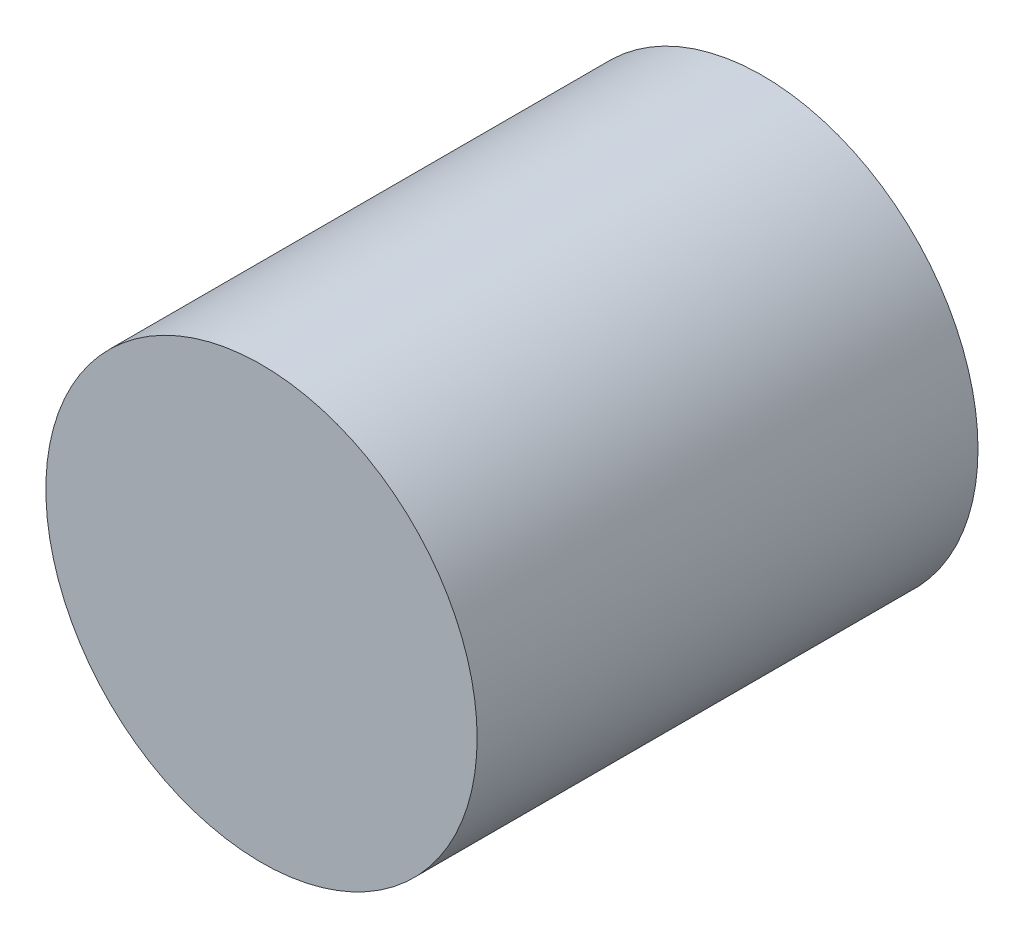
ISO-10303-21;
HEADER;
FILE_DESCRIPTION(('STEP AP214'),'2;1');
FILE_NAME('part.step','',(''),(''),'','','');
FILE_SCHEMA(('AUTOMOTIVE_DESIGN { 1 0 10303 214 1 1 1 1 }'));
ENDSEC;
DATA;
#1=APPLICATION_CONTEXT('core data for automotive mechanical design processes');
#2=APPLICATION_PROTOCOL_DEFINITION('international standard','automotive_design',2000,#1);
#3=PRODUCT_CONTEXT('',#1,'mechanical');
#4=PRODUCT('Part','Part','',(#3));
#5=PRODUCT_RELATED_PRODUCT_CATEGORY('part','',(#4));
#6=PRODUCT_DEFINITION_FORMATION('','',#4);
#7=PRODUCT_DEFINITION_CONTEXT('part definition',#1,'design');
#8=PRODUCT_DEFINITION('design','',#6,#7);
#9=PRODUCT_DEFINITION_SHAPE('','',#8);
#10=(LENGTH_UNIT() NAMED_UNIT(*) SI_UNIT(.MILLI.,.METRE.));
#11=(NAMED_UNIT(*) PLANE_ANGLE_UNIT() SI_UNIT($,.RADIAN.));
#12=(NAMED_UNIT(*) SI_UNIT($,.STERADIAN.) SOLID_ANGLE_UNIT());
#13=UNCERTAINTY_MEASURE_WITH_UNIT(LENGTH_MEASURE(1.E-05),#10,'distance_accuracy_value','');
#14=(GEOMETRIC_REPRESENTATION_CONTEXT(3) GLOBAL_UNCERTAINTY_ASSIGNED_CONTEXT((#13)) GLOBAL_UNIT_ASSIGNED_CONTEXT((#10,
#11,#12)) REPRESENTATION_CONTEXT('',''));
#15=CARTESIAN_POINT('',(0.,0.,0.));
#16=DIRECTION('',(0.,0.,1.));
#17=DIRECTION('',(1.,0.,0.));
#18=AXIS2_PLACEMENT_3D('',#15,#16,#17);
#19=CARTESIAN_POINT('',(0.,0.,3.6));
#20=DIRECTION('',(0.,0.,-1.));
#21=DIRECTION('',(-1.,0.,0.));
#22=AXIS2_PLACEMENT_3D('',#19,#20,#21);
#23=PLANE('',#22);
#24=CARTESIAN_POINT('',(0.,0.,3.6));
#25=DIRECTION('',(0.,0.,1.));
#26=DIRECTION('',(1.,0.,0.));
#27=AXIS2_PLACEMENT_3D('',#24,#25,#26);
#28=CIRCLE('',#27,1.55);
#29=CARTESIAN_POINT('',(1.55,0.,3.6));
#30=VERTEX_POINT('',#29);
#31=EDGE_CURVE('E18',#30,#30,#28,.F.);
#32=ORIENTED_EDGE('',*,*,#31,.F.);
#33=EDGE_LOOP('',(#32));
#34=FACE_BOUND('',#33,.T.);
#35=ADVANCED_FACE('F15',(#34),#23,.F.);
#36=CARTESIAN_POINT('',(0.,0.,0.));
#37=DIRECTION('',(0.,0.,-1.));
#38=DIRECTION('',(-1.,0.,0.));
#39=AXIS2_PLACEMENT_3D('',#36,#37,#38);
#40=PLANE('',#39);
#41=CARTESIAN_POINT('',(0.,0.,0.));
#42=DIRECTION('',(0.,0.,1.));
#43=DIRECTION('',(1.,0.,0.));
#44=AXIS2_PLACEMENT_3D('',#41,#42,#43);
#45=CIRCLE('',#44,1.55);
#46=CARTESIAN_POINT('',(1.55,0.,0.));
#47=VERTEX_POINT('',#46);
#48=EDGE_CURVE('E10',#47,#47,#45,.T.);
#49=ORIENTED_EDGE('',*,*,#48,.F.);
#50=EDGE_LOOP('',(#49));
#51=FACE_BOUND('',#50,.T.);
#52=ADVANCED_FACE('F30',(#51),#40,.T.);
#53=CARTESIAN_POINT('',(0.,0.,0.));
#54=DIRECTION('',(0.,0.,1.));
#55=DIRECTION('',(1.,0.,0.));
#56=AXIS2_PLACEMENT_3D('',#53,#54,#55);
#57=CYLINDRICAL_SURFACE('',#56,1.55);
#58=ORIENTED_EDGE('',*,*,#48,.T.);
#59=EDGE_LOOP('',(#58));
#60=FACE_BOUND('',#59,.T.);
#61=ORIENTED_EDGE('',*,*,#31,.T.);
#62=EDGE_LOOP('',(#61));
#63=FACE_BOUND('',#62,.T.);
#64=ADVANCED_FACE('F27',(#60,#63),#57,.T.);
#65=CLOSED_SHELL('',(#35,#52,#64));
#66=MANIFOLD_SOLID_BREP('B1',#65);
#67=ADVANCED_BREP_SHAPE_REPRESENTATION('',(#18,#66),#14);
#68=SHAPE_DEFINITION_REPRESENTATION(#9,#67);
ENDSEC;
END-ISO-10303-21;
